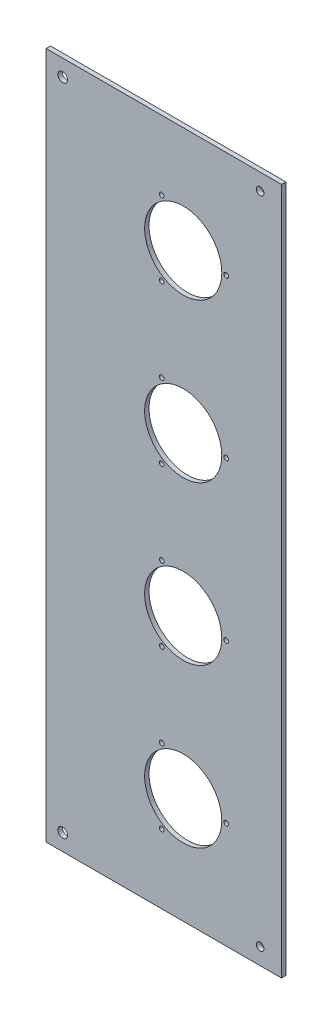
ISO-10303-21;
HEADER;
FILE_DESCRIPTION(('STEP AP214'),'2;1');
FILE_NAME('part.step','',(''),(''),'','','');
FILE_SCHEMA(('AUTOMOTIVE_DESIGN { 1 0 10303 214 1 1 1 1 }'));
ENDSEC;
DATA;
#1=APPLICATION_CONTEXT('core data for automotive mechanical design processes');
#2=APPLICATION_PROTOCOL_DEFINITION('international standard','automotive_design',2000,#1);
#3=PRODUCT_CONTEXT('',#1,'mechanical');
#4=PRODUCT('Part','Part','',(#3));
#5=PRODUCT_RELATED_PRODUCT_CATEGORY('part','',(#4));
#6=PRODUCT_DEFINITION_FORMATION('','',#4);
#7=PRODUCT_DEFINITION_CONTEXT('part definition',#1,'design');
#8=PRODUCT_DEFINITION('design','',#6,#7);
#9=PRODUCT_DEFINITION_SHAPE('','',#8);
#10=(LENGTH_UNIT() NAMED_UNIT(*) SI_UNIT(.MILLI.,.METRE.));
#11=(NAMED_UNIT(*) PLANE_ANGLE_UNIT() SI_UNIT($,.RADIAN.));
#12=(NAMED_UNIT(*) SI_UNIT($,.STERADIAN.) SOLID_ANGLE_UNIT());
#13=UNCERTAINTY_MEASURE_WITH_UNIT(LENGTH_MEASURE(1.E-05),#10,'distance_accuracy_value','');
#14=(GEOMETRIC_REPRESENTATION_CONTEXT(3) GLOBAL_UNCERTAINTY_ASSIGNED_CONTEXT((#13)) GLOBAL_UNIT_ASSIGNED_CONTEXT((#10,
#11,#12)) REPRESENTATION_CONTEXT('',''));
#15=CARTESIAN_POINT('',(0.,0.,0.));
#16=DIRECTION('',(0.,0.,1.));
#17=DIRECTION('',(1.,0.,0.));
#18=AXIS2_PLACEMENT_3D('',#15,#16,#17);
#19=CARTESIAN_POINT('',(0.,0.,3.175));
#20=DIRECTION('',(0.,0.,1.));
#21=DIRECTION('',(1.,0.,0.));
#22=AXIS2_PLACEMENT_3D('',#19,#20,#21);
#23=PLANE('',#22);
#24=CARTESIAN_POINT('',(45.305,172.25,3.175));
#25=DIRECTION('',(0.,0.,1.));
#26=DIRECTION('',(1.,0.,0.));
#27=AXIS2_PLACEMENT_3D('',#24,#25,#26);
#28=CIRCLE('',#27,1.70000000000001);
#29=CARTESIAN_POINT('',(47.005,172.25,3.175));
#30=VERTEX_POINT('',#29);
#31=EDGE_CURVE('E11',#30,#30,#28,.F.);
#32=ORIENTED_EDGE('',*,*,#31,.T.);
#33=EDGE_LOOP('',(#32));
#34=FACE_BOUND('',#33,.T.);
#35=CARTESIAN_POINT('',(-1.525,199.28731310615,3.175));
#36=DIRECTION('',(0.,0.,1.));
#37=DIRECTION('',(1.,0.,0.));
#38=AXIS2_PLACEMENT_3D('',#35,#36,#37);
#39=CIRCLE('',#38,1.69999999999998);
#40=CARTESIAN_POINT('',(0.174999999999986,199.28731310615,3.175));
#41=VERTEX_POINT('',#40);
#42=EDGE_CURVE('E57',#41,#41,#39,.F.);
#43=ORIENTED_EDGE('',*,*,#42,.T.);
#44=EDGE_LOOP('',(#43));
#45=FACE_BOUND('',#44,.T.);
#46=CARTESIAN_POINT('',(-1.52499999999997,-84.4573131061502,3.175));
#47=DIRECTION('',(0.,0.,1.));
#48=DIRECTION('',(1.,0.,0.));
#49=AXIS2_PLACEMENT_3D('',#46,#47,#48);
#50=CIRCLE('',#49,1.70000000000001);
#51=CARTESIAN_POINT('',(0.175000000000044,-84.4573131061502,3.175));
#52=VERTEX_POINT('',#51);
#53=EDGE_CURVE('E204',#52,#52,#50,.F.);
#54=ORIENTED_EDGE('',*,*,#53,.T.);
#55=EDGE_LOOP('',(#54));
#56=FACE_BOUND('',#55,.T.);
#57=CARTESIAN_POINT('',(14.085,57.42,3.175));
#58=DIRECTION('',(0.,0.,1.));
#59=DIRECTION('',(1.,0.,0.));
#60=AXIS2_PLACEMENT_3D('',#57,#58,#59);
#61=CIRCLE('',#60,28.);
#62=CARTESIAN_POINT('',(42.085,57.42,3.175));
#63=VERTEX_POINT('',#62);
#64=EDGE_CURVE('E200',#63,#63,#61,.F.);
#65=ORIENTED_EDGE('',*,*,#64,.T.);
#66=EDGE_LOOP('',(#65));
#67=FACE_BOUND('',#66,.T.);
#68=CARTESIAN_POINT('',(-73.415,-237.5,3.175));
#69=DIRECTION('',(0.,0.,1.));
#70=DIRECTION('',(1.,0.,0.));
#71=AXIS2_PLACEMENT_3D('',#68,#69,#70);
#72=CIRCLE('',#71,3.49999999999999);
#73=CARTESIAN_POINT('',(-69.915,-237.5,3.175));
#74=VERTEX_POINT('',#73);
#75=EDGE_CURVE('E196',#74,#74,#72,.T.);
#76=ORIENTED_EDGE('',*,*,#75,.F.);
#77=EDGE_LOOP('',(#76));
#78=FACE_BOUND('',#77,.T.);
#79=CARTESIAN_POINT('',(-73.415,237.5,3.175));
#80=DIRECTION('',(0.,0.,1.));
#81=DIRECTION('',(1.,0.,0.));
#82=AXIS2_PLACEMENT_3D('',#79,#80,#81);
#83=CIRCLE('',#82,3.49999999999999);
#84=CARTESIAN_POINT('',(-69.915,237.5,3.175));
#85=VERTEX_POINT('',#84);
#86=EDGE_CURVE('E192',#85,#85,#83,.T.);
#87=ORIENTED_EDGE('',*,*,#86,.F.);
#88=EDGE_LOOP('',(#87));
#89=FACE_BOUND('',#88,.T.);
#90=CARTESIAN_POINT('',(69.915,-237.5,3.175));
#91=DIRECTION('',(0.,0.,1.));
#92=DIRECTION('',(1.,0.,0.));
#93=AXIS2_PLACEMENT_3D('',#90,#91,#92);
#94=CIRCLE('',#93,2.8);
#95=CARTESIAN_POINT('',(72.715,-237.5,3.175));
#96=VERTEX_POINT('',#95);
#97=EDGE_CURVE('E188',#96,#96,#94,.T.);
#98=ORIENTED_EDGE('',*,*,#97,.F.);
#99=EDGE_LOOP('',(#98));
#100=FACE_BOUND('',#99,.T.);
#101=CARTESIAN_POINT('',(69.915,237.5,3.175));
#102=DIRECTION('',(0.,0.,1.));
#103=DIRECTION('',(1.,0.,0.));
#104=AXIS2_PLACEMENT_3D('',#101,#102,#103);
#105=CIRCLE('',#104,2.8);
#106=CARTESIAN_POINT('',(72.715,237.5,3.175));
#107=VERTEX_POINT('',#106);
#108=EDGE_CURVE('E184',#107,#107,#105,.T.);
#109=ORIENTED_EDGE('',*,*,#108,.F.);
#110=EDGE_LOOP('',(#109));
#111=FACE_BOUND('',#110,.T.);
#112=CARTESIAN_POINT('',(14.085,-172.25,3.175));
#113=DIRECTION('',(0.,0.,1.));
#114=DIRECTION('',(1.,0.,0.));
#115=AXIS2_PLACEMENT_3D('',#112,#113,#114);
#116=CIRCLE('',#115,28.);
#117=CARTESIAN_POINT('',(42.085,-172.25,3.175));
#118=VERTEX_POINT('',#117);
#119=EDGE_CURVE('E180',#118,#118,#116,.T.);
#120=ORIENTED_EDGE('',*,*,#119,.F.);
#121=EDGE_LOOP('',(#120));
#122=FACE_BOUND('',#121,.T.);
#123=CARTESIAN_POINT('',(14.085,-57.42,3.175));
#124=DIRECTION('',(0.,0.,1.));
#125=DIRECTION('',(1.,0.,0.));
#126=AXIS2_PLACEMENT_3D('',#123,#124,#125);
#127=CIRCLE('',#126,28.);
#128=CARTESIAN_POINT('',(42.085,-57.42,3.175));
#129=VERTEX_POINT('',#128);
#130=EDGE_CURVE('E176',#129,#129,#127,.T.);
#131=ORIENTED_EDGE('',*,*,#130,.F.);
#132=EDGE_LOOP('',(#131));
#133=FACE_BOUND('',#132,.T.);
#134=CARTESIAN_POINT('',(14.085,172.25,3.175));
#135=DIRECTION('',(0.,0.,1.));
#136=DIRECTION('',(1.,0.,0.));
#137=AXIS2_PLACEMENT_3D('',#134,#135,#136);
#138=CIRCLE('',#137,28.);
#139=CARTESIAN_POINT('',(42.085,172.25,3.175));
#140=VERTEX_POINT('',#139);
#141=EDGE_CURVE('E172',#140,#140,#138,.F.);
#142=ORIENTED_EDGE('',*,*,#141,.T.);
#143=EDGE_LOOP('',(#142));
#144=FACE_BOUND('',#143,.T.);
#145=CARTESIAN_POINT('',(45.305,-172.25,3.175));
#146=DIRECTION('',(0.,0.,1.));
#147=DIRECTION('',(1.,0.,0.));
#148=AXIS2_PLACEMENT_3D('',#145,#146,#147);
#149=CIRCLE('',#148,1.70000000000001);
#150=CARTESIAN_POINT('',(47.005,-172.25,3.175));
#151=VERTEX_POINT('',#150);
#152=EDGE_CURVE('E168',#151,#151,#149,.T.);
#153=ORIENTED_EDGE('',*,*,#152,.F.);
#154=EDGE_LOOP('',(#153));
#155=FACE_BOUND('',#154,.T.);
#156=CARTESIAN_POINT('',(-1.525,-199.28731310615,3.175));
#157=DIRECTION('',(0.,0.,1.));
#158=DIRECTION('',(1.,0.,0.));
#159=AXIS2_PLACEMENT_3D('',#156,#157,#158);
#160=CIRCLE('',#159,1.70000000000001);
#161=CARTESIAN_POINT('',(0.175000000000015,-199.28731310615,3.175));
#162=VERTEX_POINT('',#161);
#163=EDGE_CURVE('E164',#162,#162,#160,.T.);
#164=ORIENTED_EDGE('',*,*,#163,.F.);
#165=EDGE_LOOP('',(#164));
#166=FACE_BOUND('',#165,.T.);
#167=CARTESIAN_POINT('',(-1.52499999999997,-145.21268689385,3.175));
#168=DIRECTION('',(0.,0.,1.));
#169=DIRECTION('',(1.,0.,0.));
#170=AXIS2_PLACEMENT_3D('',#167,#168,#169);
#171=CIRCLE('',#170,1.70000000000001);
#172=CARTESIAN_POINT('',(0.175000000000043,-145.21268689385,3.175));
#173=VERTEX_POINT('',#172);
#174=EDGE_CURVE('E160',#173,#173,#171,.T.);
#175=ORIENTED_EDGE('',*,*,#174,.F.);
#176=EDGE_LOOP('',(#175));
#177=FACE_BOUND('',#176,.T.);
#178=CARTESIAN_POINT('',(-1.525,-30.3826868938499,3.175));
#179=DIRECTION('',(0.,0.,1.));
#180=DIRECTION('',(1.,0.,0.));
#181=AXIS2_PLACEMENT_3D('',#178,#179,#180);
#182=CIRCLE('',#181,1.69999999999999);
#183=CARTESIAN_POINT('',(0.174999999999994,-30.3826868938499,3.175));
#184=VERTEX_POINT('',#183);
#185=EDGE_CURVE('E156',#184,#184,#182,.F.);
#186=ORIENTED_EDGE('',*,*,#185,.T.);
#187=EDGE_LOOP('',(#186));
#188=FACE_BOUND('',#187,.T.);
#189=CARTESIAN_POINT('',(45.305,-57.42,3.175));
#190=DIRECTION('',(0.,0.,1.));
#191=DIRECTION('',(1.,0.,0.));
#192=AXIS2_PLACEMENT_3D('',#189,#190,#191);
#193=CIRCLE('',#192,1.70000000000002);
#194=CARTESIAN_POINT('',(47.005,-57.42,3.175));
#195=VERTEX_POINT('',#194);
#196=EDGE_CURVE('E152',#195,#195,#193,.F.);
#197=ORIENTED_EDGE('',*,*,#196,.T.);
#198=EDGE_LOOP('',(#197));
#199=FACE_BOUND('',#198,.T.);
#200=CARTESIAN_POINT('',(-1.52499999999997,145.21268689385,3.175));
#201=DIRECTION('',(0.,0.,1.));
#202=DIRECTION('',(1.,0.,0.));
#203=AXIS2_PLACEMENT_3D('',#200,#201,#202);
#204=CIRCLE('',#203,1.70000000000001);
#205=CARTESIAN_POINT('',(0.175000000000043,145.21268689385,3.175));
#206=VERTEX_POINT('',#205);
#207=EDGE_CURVE('E148',#206,#206,#204,.F.);
#208=ORIENTED_EDGE('',*,*,#207,.T.);
#209=EDGE_LOOP('',(#208));
#210=FACE_BOUND('',#209,.T.);
#211=CARTESIAN_POINT('',(-1.52499999999997,84.4573131061502,3.175));
#212=DIRECTION('',(0.,0.,1.));
#213=DIRECTION('',(1.,0.,0.));
#214=AXIS2_PLACEMENT_3D('',#211,#212,#213);
#215=CIRCLE('',#214,1.70000000000003);
#216=CARTESIAN_POINT('',(0.175000000000058,84.4573131061502,3.175));
#217=VERTEX_POINT('',#216);
#218=EDGE_CURVE('E144',#217,#217,#215,.T.);
#219=ORIENTED_EDGE('',*,*,#218,.F.);
#220=EDGE_LOOP('',(#219));
#221=FACE_BOUND('',#220,.T.);
#222=CARTESIAN_POINT('',(-1.525,30.3826868938499,3.175));
#223=DIRECTION('',(0.,0.,1.));
#224=DIRECTION('',(1.,0.,0.));
#225=AXIS2_PLACEMENT_3D('',#222,#223,#224);
#226=CIRCLE('',#225,1.69999999999999);
#227=CARTESIAN_POINT('',(0.174999999999994,30.3826868938499,3.175));
#228=VERTEX_POINT('',#227);
#229=EDGE_CURVE('E140',#228,#228,#226,.T.);
#230=ORIENTED_EDGE('',*,*,#229,.F.);
#231=EDGE_LOOP('',(#230));
#232=FACE_BOUND('',#231,.T.);
#233=CARTESIAN_POINT('',(45.305,57.42,3.175));
#234=DIRECTION('',(0.,0.,1.));
#235=DIRECTION('',(1.,0.,0.));
#236=AXIS2_PLACEMENT_3D('',#233,#234,#235);
#237=CIRCLE('',#236,1.70000000000003);
#238=CARTESIAN_POINT('',(47.005,57.42,3.175));
#239=VERTEX_POINT('',#238);
#240=EDGE_CURVE('E136',#239,#239,#237,.T.);
#241=ORIENTED_EDGE('',*,*,#240,.F.);
#242=EDGE_LOOP('',(#241));
#243=FACE_BOUND('',#242,.T.);
#244=DIRECTION('',(-1.,0.,0.));
#245=VECTOR('',#244,1.);
#246=CARTESIAN_POINT('',(85.415,249.5,3.175));
#247=LINE('',#246,#245);
#248=CARTESIAN_POINT('',(85.415,249.5,3.175));
#249=VERTEX_POINT('',#248);
#250=CARTESIAN_POINT('',(-85.415,249.5,3.175));
#251=VERTEX_POINT('',#250);
#252=EDGE_CURVE('E97',#249,#251,#247,.T.);
#253=ORIENTED_EDGE('',*,*,#252,.T.);
#254=DIRECTION('',(0.,-1.,0.));
#255=VECTOR('',#254,1.);
#256=CARTESIAN_POINT('',(-85.415,249.5,3.175));
#257=LINE('',#256,#255);
#258=CARTESIAN_POINT('',(-85.415,-249.5,3.175));
#259=VERTEX_POINT('',#258);
#260=EDGE_CURVE('E119',#251,#259,#257,.T.);
#261=ORIENTED_EDGE('',*,*,#260,.T.);
#262=DIRECTION('',(1.,0.,0.));
#263=VECTOR('',#262,1.);
#264=CARTESIAN_POINT('',(85.415,-249.5,3.175));
#265=LINE('',#264,#263);
#266=CARTESIAN_POINT('',(85.415,-249.5,3.175));
#267=VERTEX_POINT('',#266);
#268=EDGE_CURVE('E123',#259,#267,#265,.T.);
#269=ORIENTED_EDGE('',*,*,#268,.T.);
#270=DIRECTION('',(0.,1.,0.));
#271=VECTOR('',#270,1.);
#272=CARTESIAN_POINT('',(85.415,249.5,3.175));
#273=LINE('',#272,#271);
#274=EDGE_CURVE('E65',#267,#249,#273,.T.);
#275=ORIENTED_EDGE('',*,*,#274,.T.);
#276=EDGE_LOOP('',(#253,#261,#269,#275));
#277=FACE_BOUND('',#276,.T.);
#278=ADVANCED_FACE('F47',(#34,#45,#56,#67,#78,#89,#100,#111,#122,#133,#144,#155,#166,#177,#188,
#199,#210,#221,#232,#243,#277),#23,.T.);
#279=CARTESIAN_POINT('',(0.,0.,0.));
#280=DIRECTION('',(0.,0.,1.));
#281=DIRECTION('',(1.,0.,0.));
#282=AXIS2_PLACEMENT_3D('',#279,#280,#281);
#283=PLANE('',#282);
#284=CARTESIAN_POINT('',(45.305,172.25,0.));
#285=DIRECTION('',(0.,0.,1.));
#286=DIRECTION('',(1.,0.,0.));
#287=AXIS2_PLACEMENT_3D('',#284,#285,#286);
#288=CIRCLE('',#287,1.70000000000001);
#289=CARTESIAN_POINT('',(47.005,172.25,0.));
#290=VERTEX_POINT('',#289);
#291=EDGE_CURVE('E51',#290,#290,#288,.F.);
#292=ORIENTED_EDGE('',*,*,#291,.F.);
#293=EDGE_LOOP('',(#292));
#294=FACE_BOUND('',#293,.T.);
#295=CARTESIAN_POINT('',(-1.525,199.28731310615,0.));
#296=DIRECTION('',(0.,0.,1.));
#297=DIRECTION('',(1.,0.,0.));
#298=AXIS2_PLACEMENT_3D('',#295,#296,#297);
#299=CIRCLE('',#298,1.69999999999998);
#300=CARTESIAN_POINT('',(0.174999999999986,199.28731310615,0.));
#301=VERTEX_POINT('',#300);
#302=EDGE_CURVE('E281',#301,#301,#299,.F.);
#303=ORIENTED_EDGE('',*,*,#302,.F.);
#304=EDGE_LOOP('',(#303));
#305=FACE_BOUND('',#304,.T.);
#306=CARTESIAN_POINT('',(-1.52499999999997,-84.4573131061502,0.));
#307=DIRECTION('',(0.,0.,1.));
#308=DIRECTION('',(1.,0.,0.));
#309=AXIS2_PLACEMENT_3D('',#306,#307,#308);
#310=CIRCLE('',#309,1.70000000000001);
#311=CARTESIAN_POINT('',(0.175000000000044,-84.4573131061502,0.));
#312=VERTEX_POINT('',#311);
#313=EDGE_CURVE('E278',#312,#312,#310,.F.);
#314=ORIENTED_EDGE('',*,*,#313,.F.);
#315=EDGE_LOOP('',(#314));
#316=FACE_BOUND('',#315,.T.);
#317=CARTESIAN_POINT('',(14.085,57.42,0.));
#318=DIRECTION('',(0.,0.,1.));
#319=DIRECTION('',(1.,0.,0.));
#320=AXIS2_PLACEMENT_3D('',#317,#318,#319);
#321=CIRCLE('',#320,28.);
#322=CARTESIAN_POINT('',(42.085,57.42,0.));
#323=VERTEX_POINT('',#322);
#324=EDGE_CURVE('E274',#323,#323,#321,.F.);
#325=ORIENTED_EDGE('',*,*,#324,.F.);
#326=EDGE_LOOP('',(#325));
#327=FACE_BOUND('',#326,.T.);
#328=CARTESIAN_POINT('',(-73.415,-237.5,0.));
#329=DIRECTION('',(0.,0.,1.));
#330=DIRECTION('',(1.,0.,0.));
#331=AXIS2_PLACEMENT_3D('',#328,#329,#330);
#332=CIRCLE('',#331,3.49999999999999);
#333=CARTESIAN_POINT('',(-69.915,-237.5,0.));
#334=VERTEX_POINT('',#333);
#335=EDGE_CURVE('E270',#334,#334,#332,.T.);
#336=ORIENTED_EDGE('',*,*,#335,.T.);
#337=EDGE_LOOP('',(#336));
#338=FACE_BOUND('',#337,.T.);
#339=CARTESIAN_POINT('',(-73.415,237.5,0.));
#340=DIRECTION('',(0.,0.,1.));
#341=DIRECTION('',(1.,0.,0.));
#342=AXIS2_PLACEMENT_3D('',#339,#340,#341);
#343=CIRCLE('',#342,3.49999999999999);
#344=CARTESIAN_POINT('',(-69.915,237.5,0.));
#345=VERTEX_POINT('',#344);
#346=EDGE_CURVE('E266',#345,#345,#343,.T.);
#347=ORIENTED_EDGE('',*,*,#346,.T.);
#348=EDGE_LOOP('',(#347));
#349=FACE_BOUND('',#348,.T.);
#350=CARTESIAN_POINT('',(69.915,-237.5,0.));
#351=DIRECTION('',(0.,0.,1.));
#352=DIRECTION('',(1.,0.,0.));
#353=AXIS2_PLACEMENT_3D('',#350,#351,#352);
#354=CIRCLE('',#353,2.8);
#355=CARTESIAN_POINT('',(72.715,-237.5,0.));
#356=VERTEX_POINT('',#355);
#357=EDGE_CURVE('E262',#356,#356,#354,.T.);
#358=ORIENTED_EDGE('',*,*,#357,.T.);
#359=EDGE_LOOP('',(#358));
#360=FACE_BOUND('',#359,.T.);
#361=CARTESIAN_POINT('',(69.915,237.5,0.));
#362=DIRECTION('',(0.,0.,1.));
#363=DIRECTION('',(1.,0.,0.));
#364=AXIS2_PLACEMENT_3D('',#361,#362,#363);
#365=CIRCLE('',#364,2.8);
#366=CARTESIAN_POINT('',(72.715,237.5,0.));
#367=VERTEX_POINT('',#366);
#368=EDGE_CURVE('E258',#367,#367,#365,.T.);
#369=ORIENTED_EDGE('',*,*,#368,.T.);
#370=EDGE_LOOP('',(#369));
#371=FACE_BOUND('',#370,.T.);
#372=CARTESIAN_POINT('',(14.085,-172.25,0.));
#373=DIRECTION('',(0.,0.,1.));
#374=DIRECTION('',(1.,0.,0.));
#375=AXIS2_PLACEMENT_3D('',#372,#373,#374);
#376=CIRCLE('',#375,28.);
#377=CARTESIAN_POINT('',(42.085,-172.25,0.));
#378=VERTEX_POINT('',#377);
#379=EDGE_CURVE('E254',#378,#378,#376,.T.);
#380=ORIENTED_EDGE('',*,*,#379,.T.);
#381=EDGE_LOOP('',(#380));
#382=FACE_BOUND('',#381,.T.);
#383=CARTESIAN_POINT('',(14.085,-57.42,0.));
#384=DIRECTION('',(0.,0.,1.));
#385=DIRECTION('',(1.,0.,0.));
#386=AXIS2_PLACEMENT_3D('',#383,#384,#385);
#387=CIRCLE('',#386,28.);
#388=CARTESIAN_POINT('',(42.085,-57.42,0.));
#389=VERTEX_POINT('',#388);
#390=EDGE_CURVE('E250',#389,#389,#387,.T.);
#391=ORIENTED_EDGE('',*,*,#390,.T.);
#392=EDGE_LOOP('',(#391));
#393=FACE_BOUND('',#392,.T.);
#394=CARTESIAN_POINT('',(14.085,172.25,0.));
#395=DIRECTION('',(0.,0.,1.));
#396=DIRECTION('',(1.,0.,0.));
#397=AXIS2_PLACEMENT_3D('',#394,#395,#396);
#398=CIRCLE('',#397,28.);
#399=CARTESIAN_POINT('',(42.085,172.25,0.));
#400=VERTEX_POINT('',#399);
#401=EDGE_CURVE('E246',#400,#400,#398,.F.);
#402=ORIENTED_EDGE('',*,*,#401,.F.);
#403=EDGE_LOOP('',(#402));
#404=FACE_BOUND('',#403,.T.);
#405=CARTESIAN_POINT('',(45.305,-172.25,0.));
#406=DIRECTION('',(0.,0.,1.));
#407=DIRECTION('',(1.,0.,0.));
#408=AXIS2_PLACEMENT_3D('',#405,#406,#407);
#409=CIRCLE('',#408,1.70000000000001);
#410=CARTESIAN_POINT('',(47.005,-172.25,0.));
#411=VERTEX_POINT('',#410);
#412=EDGE_CURVE('E242',#411,#411,#409,.T.);
#413=ORIENTED_EDGE('',*,*,#412,.T.);
#414=EDGE_LOOP('',(#413));
#415=FACE_BOUND('',#414,.T.);
#416=CARTESIAN_POINT('',(-1.525,-199.28731310615,0.));
#417=DIRECTION('',(0.,0.,1.));
#418=DIRECTION('',(1.,0.,0.));
#419=AXIS2_PLACEMENT_3D('',#416,#417,#418);
#420=CIRCLE('',#419,1.70000000000001);
#421=CARTESIAN_POINT('',(0.175000000000015,-199.28731310615,0.));
#422=VERTEX_POINT('',#421);
#423=EDGE_CURVE('E238',#422,#422,#420,.T.);
#424=ORIENTED_EDGE('',*,*,#423,.T.);
#425=EDGE_LOOP('',(#424));
#426=FACE_BOUND('',#425,.T.);
#427=CARTESIAN_POINT('',(-1.52499999999997,-145.21268689385,0.));
#428=DIRECTION('',(0.,0.,1.));
#429=DIRECTION('',(1.,0.,0.));
#430=AXIS2_PLACEMENT_3D('',#427,#428,#429);
#431=CIRCLE('',#430,1.70000000000001);
#432=CARTESIAN_POINT('',(0.175000000000043,-145.21268689385,0.));
#433=VERTEX_POINT('',#432);
#434=EDGE_CURVE('E234',#433,#433,#431,.T.);
#435=ORIENTED_EDGE('',*,*,#434,.T.);
#436=EDGE_LOOP('',(#435));
#437=FACE_BOUND('',#436,.T.);
#438=CARTESIAN_POINT('',(-1.525,-30.3826868938499,0.));
#439=DIRECTION('',(0.,0.,1.));
#440=DIRECTION('',(1.,0.,0.));
#441=AXIS2_PLACEMENT_3D('',#438,#439,#440);
#442=CIRCLE('',#441,1.69999999999999);
#443=CARTESIAN_POINT('',(0.174999999999994,-30.3826868938499,0.));
#444=VERTEX_POINT('',#443);
#445=EDGE_CURVE('E230',#444,#444,#442,.F.);
#446=ORIENTED_EDGE('',*,*,#445,.F.);
#447=EDGE_LOOP('',(#446));
#448=FACE_BOUND('',#447,.T.);
#449=CARTESIAN_POINT('',(45.305,-57.42,0.));
#450=DIRECTION('',(0.,0.,1.));
#451=DIRECTION('',(1.,0.,0.));
#452=AXIS2_PLACEMENT_3D('',#449,#450,#451);
#453=CIRCLE('',#452,1.70000000000002);
#454=CARTESIAN_POINT('',(47.005,-57.42,0.));
#455=VERTEX_POINT('',#454);
#456=EDGE_CURVE('E226',#455,#455,#453,.F.);
#457=ORIENTED_EDGE('',*,*,#456,.F.);
#458=EDGE_LOOP('',(#457));
#459=FACE_BOUND('',#458,.T.);
#460=CARTESIAN_POINT('',(-1.52499999999997,145.21268689385,0.));
#461=DIRECTION('',(0.,0.,1.));
#462=DIRECTION('',(1.,0.,0.));
#463=AXIS2_PLACEMENT_3D('',#460,#461,#462);
#464=CIRCLE('',#463,1.70000000000001);
#465=CARTESIAN_POINT('',(0.175000000000043,145.21268689385,0.));
#466=VERTEX_POINT('',#465);
#467=EDGE_CURVE('E222',#466,#466,#464,.F.);
#468=ORIENTED_EDGE('',*,*,#467,.F.);
#469=EDGE_LOOP('',(#468));
#470=FACE_BOUND('',#469,.T.);
#471=CARTESIAN_POINT('',(-1.52499999999997,84.4573131061502,0.));
#472=DIRECTION('',(0.,0.,1.));
#473=DIRECTION('',(1.,0.,0.));
#474=AXIS2_PLACEMENT_3D('',#471,#472,#473);
#475=CIRCLE('',#474,1.70000000000003);
#476=CARTESIAN_POINT('',(0.175000000000058,84.4573131061502,0.));
#477=VERTEX_POINT('',#476);
#478=EDGE_CURVE('E218',#477,#477,#475,.T.);
#479=ORIENTED_EDGE('',*,*,#478,.T.);
#480=EDGE_LOOP('',(#479));
#481=FACE_BOUND('',#480,.T.);
#482=CARTESIAN_POINT('',(-1.525,30.3826868938499,0.));
#483=DIRECTION('',(0.,0.,1.));
#484=DIRECTION('',(1.,0.,0.));
#485=AXIS2_PLACEMENT_3D('',#482,#483,#484);
#486=CIRCLE('',#485,1.69999999999999);
#487=CARTESIAN_POINT('',(0.174999999999994,30.3826868938499,0.));
#488=VERTEX_POINT('',#487);
#489=EDGE_CURVE('E214',#488,#488,#486,.T.);
#490=ORIENTED_EDGE('',*,*,#489,.T.);
#491=EDGE_LOOP('',(#490));
#492=FACE_BOUND('',#491,.T.);
#493=CARTESIAN_POINT('',(45.305,57.42,0.));
#494=DIRECTION('',(0.,0.,1.));
#495=DIRECTION('',(1.,0.,0.));
#496=AXIS2_PLACEMENT_3D('',#493,#494,#495);
#497=CIRCLE('',#496,1.70000000000003);
#498=CARTESIAN_POINT('',(47.005,57.42,0.));
#499=VERTEX_POINT('',#498);
#500=EDGE_CURVE('E132',#499,#499,#497,.T.);
#501=ORIENTED_EDGE('',*,*,#500,.T.);
#502=EDGE_LOOP('',(#501));
#503=FACE_BOUND('',#502,.T.);
#504=DIRECTION('',(0.,-1.,0.));
#505=VECTOR('',#504,1.);
#506=CARTESIAN_POINT('',(-85.415,249.5,0.));
#507=LINE('',#506,#505);
#508=CARTESIAN_POINT('',(-85.415,249.5,0.));
#509=VERTEX_POINT('',#508);
#510=CARTESIAN_POINT('',(-85.415,-249.5,0.));
#511=VERTEX_POINT('',#510);
#512=EDGE_CURVE('E73',#509,#511,#507,.T.);
#513=ORIENTED_EDGE('',*,*,#512,.F.);
#514=DIRECTION('',(-1.,0.,0.));
#515=VECTOR('',#514,1.);
#516=CARTESIAN_POINT('',(85.415,249.5,0.));
#517=LINE('',#516,#515);
#518=CARTESIAN_POINT('',(85.415,249.5,0.));
#519=VERTEX_POINT('',#518);
#520=EDGE_CURVE('E95',#519,#509,#517,.T.);
#521=ORIENTED_EDGE('',*,*,#520,.F.);
#522=DIRECTION('',(0.,1.,0.));
#523=VECTOR('',#522,1.);
#524=CARTESIAN_POINT('',(85.415,249.5,0.));
#525=LINE('',#524,#523);
#526=CARTESIAN_POINT('',(85.415,-249.5,0.));
#527=VERTEX_POINT('',#526);
#528=EDGE_CURVE('E103',#527,#519,#525,.T.);
#529=ORIENTED_EDGE('',*,*,#528,.F.);
#530=DIRECTION('',(1.,0.,0.));
#531=VECTOR('',#530,1.);
#532=CARTESIAN_POINT('',(85.415,-249.5,0.));
#533=LINE('',#532,#531);
#534=EDGE_CURVE('E109',#511,#527,#533,.T.);
#535=ORIENTED_EDGE('',*,*,#534,.F.);
#536=EDGE_LOOP('',(#513,#521,#529,#535));
#537=FACE_BOUND('',#536,.T.);
#538=ADVANCED_FACE('F111',(#294,#305,#316,#327,#338,#349,#360,#371,#382,#393,#404,#415,#426,
#437,#448,#459,#470,#481,#492,#503,#537),#283,.F.);
#539=CARTESIAN_POINT('',(-1.525,199.28731310615,3.175));
#540=DIRECTION('',(0.,0.,-1.));
#541=DIRECTION('',(-1.,0.,0.));
#542=AXIS2_PLACEMENT_3D('',#539,#540,#541);
#543=CYLINDRICAL_SURFACE('',#542,1.69999999999998);
#544=ORIENTED_EDGE('',*,*,#42,.F.);
#545=EDGE_LOOP('',(#544));
#546=FACE_BOUND('',#545,.T.);
#547=ORIENTED_EDGE('',*,*,#302,.T.);
#548=EDGE_LOOP('',(#547));
#549=FACE_BOUND('',#548,.T.);
#550=ADVANCED_FACE('F294',(#546,#549),#543,.F.);
#551=CARTESIAN_POINT('',(-1.52499999999997,-84.4573131061502,3.175));
#552=DIRECTION('',(0.,0.,-1.));
#553=DIRECTION('',(-1.,0.,0.));
#554=AXIS2_PLACEMENT_3D('',#551,#552,#553);
#555=CYLINDRICAL_SURFACE('',#554,1.70000000000001);
#556=ORIENTED_EDGE('',*,*,#53,.F.);
#557=EDGE_LOOP('',(#556));
#558=FACE_BOUND('',#557,.T.);
#559=ORIENTED_EDGE('',*,*,#313,.T.);
#560=EDGE_LOOP('',(#559));
#561=FACE_BOUND('',#560,.T.);
#562=ADVANCED_FACE('F356',(#558,#561),#555,.F.);
#563=CARTESIAN_POINT('',(14.085,57.42,3.175));
#564=DIRECTION('',(0.,0.,-1.));
#565=DIRECTION('',(-1.,0.,0.));
#566=AXIS2_PLACEMENT_3D('',#563,#564,#565);
#567=CYLINDRICAL_SURFACE('',#566,28.);
#568=ORIENTED_EDGE('',*,*,#64,.F.);
#569=EDGE_LOOP('',(#568));
#570=FACE_BOUND('',#569,.T.);
#571=ORIENTED_EDGE('',*,*,#324,.T.);
#572=EDGE_LOOP('',(#571));
#573=FACE_BOUND('',#572,.T.);
#574=ADVANCED_FACE('F360',(#570,#573),#567,.F.);
#575=CARTESIAN_POINT('',(-73.415,-237.5,3.175));
#576=DIRECTION('',(0.,0.,-1.));
#577=DIRECTION('',(-1.,0.,0.));
#578=AXIS2_PLACEMENT_3D('',#575,#576,#577);
#579=CYLINDRICAL_SURFACE('',#578,3.49999999999999);
#580=ORIENTED_EDGE('',*,*,#75,.T.);
#581=EDGE_LOOP('',(#580));
#582=FACE_BOUND('',#581,.T.);
#583=ORIENTED_EDGE('',*,*,#335,.F.);
#584=EDGE_LOOP('',(#583));
#585=FACE_BOUND('',#584,.T.);
#586=ADVANCED_FACE('F364',(#582,#585),#579,.F.);
#587=CARTESIAN_POINT('',(-73.415,237.5,3.175));
#588=DIRECTION('',(0.,0.,-1.));
#589=DIRECTION('',(-1.,0.,0.));
#590=AXIS2_PLACEMENT_3D('',#587,#588,#589);
#591=CYLINDRICAL_SURFACE('',#590,3.49999999999999);
#592=ORIENTED_EDGE('',*,*,#86,.T.);
#593=EDGE_LOOP('',(#592));
#594=FACE_BOUND('',#593,.T.);
#595=ORIENTED_EDGE('',*,*,#346,.F.);
#596=EDGE_LOOP('',(#595));
#597=FACE_BOUND('',#596,.T.);
#598=ADVANCED_FACE('F368',(#594,#597),#591,.F.);
#599=CARTESIAN_POINT('',(69.915,-237.5,3.175));
#600=DIRECTION('',(0.,0.,-1.));
#601=DIRECTION('',(-1.,0.,0.));
#602=AXIS2_PLACEMENT_3D('',#599,#600,#601);
#603=CYLINDRICAL_SURFACE('',#602,2.8);
#604=ORIENTED_EDGE('',*,*,#97,.T.);
#605=EDGE_LOOP('',(#604));
#606=FACE_BOUND('',#605,.T.);
#607=ORIENTED_EDGE('',*,*,#357,.F.);
#608=EDGE_LOOP('',(#607));
#609=FACE_BOUND('',#608,.T.);
#610=ADVANCED_FACE('F372',(#606,#609),#603,.F.);
#611=CARTESIAN_POINT('',(69.915,237.5,3.175));
#612=DIRECTION('',(0.,0.,-1.));
#613=DIRECTION('',(-1.,0.,0.));
#614=AXIS2_PLACEMENT_3D('',#611,#612,#613);
#615=CYLINDRICAL_SURFACE('',#614,2.8);
#616=ORIENTED_EDGE('',*,*,#108,.T.);
#617=EDGE_LOOP('',(#616));
#618=FACE_BOUND('',#617,.T.);
#619=ORIENTED_EDGE('',*,*,#368,.F.);
#620=EDGE_LOOP('',(#619));
#621=FACE_BOUND('',#620,.T.);
#622=ADVANCED_FACE('F376',(#618,#621),#615,.F.);
#623=CARTESIAN_POINT('',(14.085,-172.25,3.175));
#624=DIRECTION('',(0.,0.,-1.));
#625=DIRECTION('',(-1.,0.,0.));
#626=AXIS2_PLACEMENT_3D('',#623,#624,#625);
#627=CYLINDRICAL_SURFACE('',#626,28.);
#628=ORIENTED_EDGE('',*,*,#119,.T.);
#629=EDGE_LOOP('',(#628));
#630=FACE_BOUND('',#629,.T.);
#631=ORIENTED_EDGE('',*,*,#379,.F.);
#632=EDGE_LOOP('',(#631));
#633=FACE_BOUND('',#632,.T.);
#634=ADVANCED_FACE('F380',(#630,#633),#627,.F.);
#635=CARTESIAN_POINT('',(14.085,-57.42,3.175));
#636=DIRECTION('',(0.,0.,-1.));
#637=DIRECTION('',(-1.,0.,0.));
#638=AXIS2_PLACEMENT_3D('',#635,#636,#637);
#639=CYLINDRICAL_SURFACE('',#638,28.);
#640=ORIENTED_EDGE('',*,*,#130,.T.);
#641=EDGE_LOOP('',(#640));
#642=FACE_BOUND('',#641,.T.);
#643=ORIENTED_EDGE('',*,*,#390,.F.);
#644=EDGE_LOOP('',(#643));
#645=FACE_BOUND('',#644,.T.);
#646=ADVANCED_FACE('F384',(#642,#645),#639,.F.);
#647=CARTESIAN_POINT('',(14.085,172.25,3.175));
#648=DIRECTION('',(0.,0.,-1.));
#649=DIRECTION('',(-1.,0.,0.));
#650=AXIS2_PLACEMENT_3D('',#647,#648,#649);
#651=CYLINDRICAL_SURFACE('',#650,28.);
#652=ORIENTED_EDGE('',*,*,#141,.F.);
#653=EDGE_LOOP('',(#652));
#654=FACE_BOUND('',#653,.T.);
#655=ORIENTED_EDGE('',*,*,#401,.T.);
#656=EDGE_LOOP('',(#655));
#657=FACE_BOUND('',#656,.T.);
#658=ADVANCED_FACE('F388',(#654,#657),#651,.F.);
#659=CARTESIAN_POINT('',(45.305,-172.25,3.175));
#660=DIRECTION('',(0.,0.,-1.));
#661=DIRECTION('',(-1.,0.,0.));
#662=AXIS2_PLACEMENT_3D('',#659,#660,#661);
#663=CYLINDRICAL_SURFACE('',#662,1.70000000000001);
#664=ORIENTED_EDGE('',*,*,#152,.T.);
#665=EDGE_LOOP('',(#664));
#666=FACE_BOUND('',#665,.T.);
#667=ORIENTED_EDGE('',*,*,#412,.F.);
#668=EDGE_LOOP('',(#667));
#669=FACE_BOUND('',#668,.T.);
#670=ADVANCED_FACE('F392',(#666,#669),#663,.F.);
#671=CARTESIAN_POINT('',(-1.525,-199.28731310615,3.175));
#672=DIRECTION('',(0.,0.,-1.));
#673=DIRECTION('',(-1.,0.,0.));
#674=AXIS2_PLACEMENT_3D('',#671,#672,#673);
#675=CYLINDRICAL_SURFACE('',#674,1.70000000000001);
#676=ORIENTED_EDGE('',*,*,#163,.T.);
#677=EDGE_LOOP('',(#676));
#678=FACE_BOUND('',#677,.T.);
#679=ORIENTED_EDGE('',*,*,#423,.F.);
#680=EDGE_LOOP('',(#679));
#681=FACE_BOUND('',#680,.T.);
#682=ADVANCED_FACE('F396',(#678,#681),#675,.F.);
#683=CARTESIAN_POINT('',(-1.52499999999997,-145.21268689385,3.175));
#684=DIRECTION('',(0.,0.,-1.));
#685=DIRECTION('',(-1.,0.,0.));
#686=AXIS2_PLACEMENT_3D('',#683,#684,#685);
#687=CYLINDRICAL_SURFACE('',#686,1.70000000000001);
#688=ORIENTED_EDGE('',*,*,#174,.T.);
#689=EDGE_LOOP('',(#688));
#690=FACE_BOUND('',#689,.T.);
#691=ORIENTED_EDGE('',*,*,#434,.F.);
#692=EDGE_LOOP('',(#691));
#693=FACE_BOUND('',#692,.T.);
#694=ADVANCED_FACE('F400',(#690,#693),#687,.F.);
#695=CARTESIAN_POINT('',(-1.525,-30.3826868938499,3.175));
#696=DIRECTION('',(0.,0.,-1.));
#697=DIRECTION('',(-1.,0.,0.));
#698=AXIS2_PLACEMENT_3D('',#695,#696,#697);
#699=CYLINDRICAL_SURFACE('',#698,1.69999999999999);
#700=ORIENTED_EDGE('',*,*,#185,.F.);
#701=EDGE_LOOP('',(#700));
#702=FACE_BOUND('',#701,.T.);
#703=ORIENTED_EDGE('',*,*,#445,.T.);
#704=EDGE_LOOP('',(#703));
#705=FACE_BOUND('',#704,.T.);
#706=ADVANCED_FACE('F404',(#702,#705),#699,.F.);
#707=CARTESIAN_POINT('',(45.305,-57.42,3.175));
#708=DIRECTION('',(0.,0.,-1.));
#709=DIRECTION('',(-1.,0.,0.));
#710=AXIS2_PLACEMENT_3D('',#707,#708,#709);
#711=CYLINDRICAL_SURFACE('',#710,1.70000000000002);
#712=ORIENTED_EDGE('',*,*,#196,.F.);
#713=EDGE_LOOP('',(#712));
#714=FACE_BOUND('',#713,.T.);
#715=ORIENTED_EDGE('',*,*,#456,.T.);
#716=EDGE_LOOP('',(#715));
#717=FACE_BOUND('',#716,.T.);
#718=ADVANCED_FACE('F408',(#714,#717),#711,.F.);
#719=CARTESIAN_POINT('',(-1.52499999999997,145.21268689385,3.175));
#720=DIRECTION('',(0.,0.,-1.));
#721=DIRECTION('',(-1.,0.,0.));
#722=AXIS2_PLACEMENT_3D('',#719,#720,#721);
#723=CYLINDRICAL_SURFACE('',#722,1.70000000000001);
#724=ORIENTED_EDGE('',*,*,#207,.F.);
#725=EDGE_LOOP('',(#724));
#726=FACE_BOUND('',#725,.T.);
#727=ORIENTED_EDGE('',*,*,#467,.T.);
#728=EDGE_LOOP('',(#727));
#729=FACE_BOUND('',#728,.T.);
#730=ADVANCED_FACE('F412',(#726,#729),#723,.F.);
#731=CARTESIAN_POINT('',(-1.52499999999997,84.4573131061502,3.175));
#732=DIRECTION('',(0.,0.,-1.));
#733=DIRECTION('',(-1.,0.,0.));
#734=AXIS2_PLACEMENT_3D('',#731,#732,#733);
#735=CYLINDRICAL_SURFACE('',#734,1.70000000000003);
#736=ORIENTED_EDGE('',*,*,#218,.T.);
#737=EDGE_LOOP('',(#736));
#738=FACE_BOUND('',#737,.T.);
#739=ORIENTED_EDGE('',*,*,#478,.F.);
#740=EDGE_LOOP('',(#739));
#741=FACE_BOUND('',#740,.T.);
#742=ADVANCED_FACE('F343',(#738,#741),#735,.F.);
#743=CARTESIAN_POINT('',(-1.525,30.3826868938499,3.175));
#744=DIRECTION('',(0.,0.,-1.));
#745=DIRECTION('',(-1.,0.,0.));
#746=AXIS2_PLACEMENT_3D('',#743,#744,#745);
#747=CYLINDRICAL_SURFACE('',#746,1.69999999999999);
#748=ORIENTED_EDGE('',*,*,#229,.T.);
#749=EDGE_LOOP('',(#748));
#750=FACE_BOUND('',#749,.T.);
#751=ORIENTED_EDGE('',*,*,#489,.F.);
#752=EDGE_LOOP('',(#751));
#753=FACE_BOUND('',#752,.T.);
#754=ADVANCED_FACE('F334',(#750,#753),#747,.F.);
#755=CARTESIAN_POINT('',(45.305,57.42,3.175));
#756=DIRECTION('',(0.,0.,-1.));
#757=DIRECTION('',(-1.,0.,0.));
#758=AXIS2_PLACEMENT_3D('',#755,#756,#757);
#759=CYLINDRICAL_SURFACE('',#758,1.70000000000003);
#760=ORIENTED_EDGE('',*,*,#240,.T.);
#761=EDGE_LOOP('',(#760));
#762=FACE_BOUND('',#761,.T.);
#763=ORIENTED_EDGE('',*,*,#500,.F.);
#764=EDGE_LOOP('',(#763));
#765=FACE_BOUND('',#764,.T.);
#766=ADVANCED_FACE('F49',(#762,#765),#759,.F.);
#767=CARTESIAN_POINT('',(45.305,172.25,3.175));
#768=DIRECTION('',(0.,0.,-1.));
#769=DIRECTION('',(-1.,0.,0.));
#770=AXIS2_PLACEMENT_3D('',#767,#768,#769);
#771=CYLINDRICAL_SURFACE('',#770,1.70000000000001);
#772=ORIENTED_EDGE('',*,*,#31,.F.);
#773=EDGE_LOOP('',(#772));
#774=FACE_BOUND('',#773,.T.);
#775=ORIENTED_EDGE('',*,*,#291,.T.);
#776=EDGE_LOOP('',(#775));
#777=FACE_BOUND('',#776,.T.);
#778=ADVANCED_FACE('F290',(#774,#777),#771,.F.);
#779=CARTESIAN_POINT('',(-85.415,249.5,0.));
#780=DIRECTION('',(-1.,0.,0.));
#781=DIRECTION('',(0.,0.,1.));
#782=AXIS2_PLACEMENT_3D('',#779,#780,#781);
#783=PLANE('',#782);
#784=ORIENTED_EDGE('',*,*,#260,.F.);
#785=DIRECTION('',(0.,0.,1.));
#786=VECTOR('',#785,1.);
#787=CARTESIAN_POINT('',(-85.415,249.5,0.));
#788=LINE('',#787,#786);
#789=EDGE_CURVE('E99',#509,#251,#788,.T.);
#790=ORIENTED_EDGE('',*,*,#789,.F.);
#791=ORIENTED_EDGE('',*,*,#512,.T.);
#792=DIRECTION('',(0.,0.,1.));
#793=VECTOR('',#792,1.);
#794=CARTESIAN_POINT('',(-85.415,-249.5,0.));
#795=LINE('',#794,#793);
#796=EDGE_CURVE('E113',#511,#259,#795,.T.);
#797=ORIENTED_EDGE('',*,*,#796,.T.);
#798=EDGE_LOOP('',(#784,#790,#791,#797));
#799=FACE_BOUND('',#798,.T.);
#800=ADVANCED_FACE('F340',(#799),#783,.T.);
#801=CARTESIAN_POINT('',(85.415,249.5,0.));
#802=DIRECTION('',(0.,1.,0.));
#803=DIRECTION('',(0.,0.,1.));
#804=AXIS2_PLACEMENT_3D('',#801,#802,#803);
#805=PLANE('',#804);
#806=ORIENTED_EDGE('',*,*,#252,.F.);
#807=DIRECTION('',(0.,0.,1.));
#808=VECTOR('',#807,1.);
#809=CARTESIAN_POINT('',(85.415,249.5,0.));
#810=LINE('',#809,#808);
#811=EDGE_CURVE('E91',#519,#249,#810,.T.);
#812=ORIENTED_EDGE('',*,*,#811,.F.);
#813=ORIENTED_EDGE('',*,*,#520,.T.);
#814=ORIENTED_EDGE('',*,*,#789,.T.);
#815=EDGE_LOOP('',(#806,#812,#813,#814));
#816=FACE_BOUND('',#815,.T.);
#817=ADVANCED_FACE('F93',(#816),#805,.T.);
#818=CARTESIAN_POINT('',(85.415,249.5,0.));
#819=DIRECTION('',(1.,0.,0.));
#820=DIRECTION('',(0.,0.,-1.));
#821=AXIS2_PLACEMENT_3D('',#818,#819,#820);
#822=PLANE('',#821);
#823=ORIENTED_EDGE('',*,*,#274,.F.);
#824=DIRECTION('',(0.,0.,1.));
#825=VECTOR('',#824,1.);
#826=CARTESIAN_POINT('',(85.415,-249.5,0.));
#827=LINE('',#826,#825);
#828=EDGE_CURVE('E100',#527,#267,#827,.T.);
#829=ORIENTED_EDGE('',*,*,#828,.F.);
#830=ORIENTED_EDGE('',*,*,#528,.T.);
#831=ORIENTED_EDGE('',*,*,#811,.T.);
#832=EDGE_LOOP('',(#823,#829,#830,#831));
#833=FACE_BOUND('',#832,.T.);
#834=ADVANCED_FACE('F104',(#833),#822,.T.);
#835=CARTESIAN_POINT('',(85.415,-249.5,0.));
#836=DIRECTION('',(0.,-1.,0.));
#837=DIRECTION('',(0.,0.,-1.));
#838=AXIS2_PLACEMENT_3D('',#835,#836,#837);
#839=PLANE('',#838);
#840=ORIENTED_EDGE('',*,*,#268,.F.);
#841=ORIENTED_EDGE('',*,*,#796,.F.);
#842=ORIENTED_EDGE('',*,*,#534,.T.);
#843=ORIENTED_EDGE('',*,*,#828,.T.);
#844=EDGE_LOOP('',(#840,#841,#842,#843));
#845=FACE_BOUND('',#844,.T.);
#846=ADVANCED_FACE('F432',(#845),#839,.T.);
#847=CLOSED_SHELL('',(#278,#538,#550,#562,#574,#586,#598,#610,#622,#634,#646,#658,#670,#682,
#694,#706,#718,#730,#742,#754,#766,#778,#800,#817,#834,#846));
#848=MANIFOLD_SOLID_BREP('B2',#847);
#849=ADVANCED_BREP_SHAPE_REPRESENTATION('',(#18,#848),#14);
#850=SHAPE_DEFINITION_REPRESENTATION(#9,#849);
ENDSEC;
END-ISO-10303-21;
